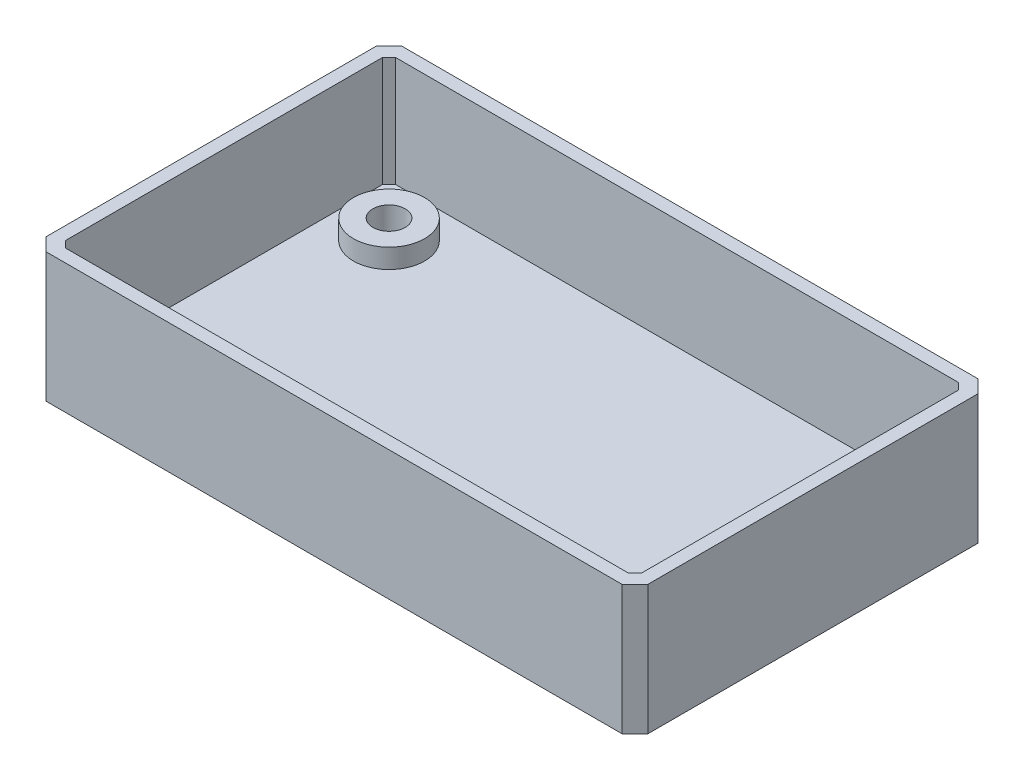
ISO-10303-21;
HEADER;
FILE_DESCRIPTION(('STEP AP214'),'2;1');
FILE_NAME('part.step','',(''),(''),'','','');
FILE_SCHEMA(('AUTOMOTIVE_DESIGN { 1 0 10303 214 1 1 1 1 }'));
ENDSEC;
DATA;
#1=APPLICATION_CONTEXT('core data for automotive mechanical design processes');
#2=APPLICATION_PROTOCOL_DEFINITION('international standard','automotive_design',2000,#1);
#3=PRODUCT_CONTEXT('',#1,'mechanical');
#4=PRODUCT('Part','Part','',(#3));
#5=PRODUCT_RELATED_PRODUCT_CATEGORY('part','',(#4));
#6=PRODUCT_DEFINITION_FORMATION('','',#4);
#7=PRODUCT_DEFINITION_CONTEXT('part definition',#1,'design');
#8=PRODUCT_DEFINITION('design','',#6,#7);
#9=PRODUCT_DEFINITION_SHAPE('','',#8);
#10=(LENGTH_UNIT() NAMED_UNIT(*) SI_UNIT(.MILLI.,.METRE.));
#11=(NAMED_UNIT(*) PLANE_ANGLE_UNIT() SI_UNIT($,.RADIAN.));
#12=(NAMED_UNIT(*) SI_UNIT($,.STERADIAN.) SOLID_ANGLE_UNIT());
#13=UNCERTAINTY_MEASURE_WITH_UNIT(LENGTH_MEASURE(1.E-05),#10,'distance_accuracy_value','');
#14=(GEOMETRIC_REPRESENTATION_CONTEXT(3) GLOBAL_UNCERTAINTY_ASSIGNED_CONTEXT((#13)) GLOBAL_UNIT_ASSIGNED_CONTEXT((#10,
#11,#12)) REPRESENTATION_CONTEXT('',''));
#15=CARTESIAN_POINT('',(0.,0.,0.));
#16=DIRECTION('',(0.,0.,1.));
#17=DIRECTION('',(1.,0.,0.));
#18=AXIS2_PLACEMENT_3D('',#15,#16,#17);
#19=CARTESIAN_POINT('',(0.,3.,0.));
#20=DIRECTION('',(0.,1.,0.));
#21=DIRECTION('',(0.,0.,1.));
#22=AXIS2_PLACEMENT_3D('',#19,#20,#21);
#23=PLANE('',#22);
#24=CARTESIAN_POINT('',(73.,3.,35.));
#25=DIRECTION('',(0.,1.,0.));
#26=DIRECTION('',(0.,0.,1.));
#27=AXIS2_PLACEMENT_3D('',#24,#25,#26);
#28=CIRCLE('',#27,5.5);
#29=CARTESIAN_POINT('',(73.,3.,40.5));
#30=VERTEX_POINT('',#29);
#31=EDGE_CURVE('E326',#30,#30,#28,.T.);
#32=ORIENTED_EDGE('',*,*,#31,.F.);
#33=EDGE_LOOP('',(#32));
#34=FACE_BOUND('',#33,.T.);
#35=CARTESIAN_POINT('',(0.,3.,0.));
#36=DIRECTION('',(0.,1.,0.));
#37=DIRECTION('',(0.,0.,1.));
#38=AXIS2_PLACEMENT_3D('',#35,#36,#37);
#39=CIRCLE('',#38,5.5);
#40=CARTESIAN_POINT('',(0.,3.,5.5));
#41=VERTEX_POINT('',#40);
#42=EDGE_CURVE('E344',#41,#41,#39,.T.);
#43=ORIENTED_EDGE('',*,*,#42,.F.);
#44=EDGE_LOOP('',(#43));
#45=FACE_BOUND('',#44,.T.);
#46=DIRECTION('',(0.,0.,1.));
#47=VECTOR('',#46,1.);
#48=CARTESIAN_POINT('',(-8.,3.,-8.));
#49=LINE('',#48,#47);
#50=CARTESIAN_POINT('',(-8.,3.,-7.));
#51=VERTEX_POINT('',#50);
#52=CARTESIAN_POINT('',(-7.99999999999999,3.,42.));
#53=VERTEX_POINT('',#52);
#54=EDGE_CURVE('E266',#51,#53,#49,.T.);
#55=ORIENTED_EDGE('',*,*,#54,.T.);
#56=DIRECTION('',(-0.707106781186538,0.,-0.707106781186557));
#57=VECTOR('',#56,1.);
#58=CARTESIAN_POINT('',(-25.0000000000001,3.,24.9999999999994));
#59=LINE('',#58,#57);
#60=CARTESIAN_POINT('',(-7.00000000000001,3.,43.));
#61=VERTEX_POINT('',#60);
#62=EDGE_CURVE('E225',#53,#61,#59,.F.);
#63=ORIENTED_EDGE('',*,*,#62,.T.);
#64=DIRECTION('',(1.,0.,0.));
#65=VECTOR('',#64,1.);
#66=CARTESIAN_POINT('',(-7.99999999999999,3.,43.));
#67=LINE('',#66,#65);
#68=CARTESIAN_POINT('',(80.,3.,43.));
#69=VERTEX_POINT('',#68);
#70=EDGE_CURVE('E270',#61,#69,#67,.T.);
#71=ORIENTED_EDGE('',*,*,#70,.T.);
#72=DIRECTION('',(-0.707106781186543,0.,0.707106781186552));
#73=VECTOR('',#72,1.);
#74=CARTESIAN_POINT('',(61.5000000000006,3.,61.4999999999997));
#75=LINE('',#74,#73);
#76=CARTESIAN_POINT('',(81.,3.,42.));
#77=VERTEX_POINT('',#76);
#78=EDGE_CURVE('E219',#69,#77,#75,.F.);
#79=ORIENTED_EDGE('',*,*,#78,.T.);
#80=DIRECTION('',(0.,0.,-1.));
#81=VECTOR('',#80,1.);
#82=CARTESIAN_POINT('',(81.,3.,-8.));
#83=LINE('',#82,#81);
#84=CARTESIAN_POINT('',(81.,3.,-6.99999999999999));
#85=VERTEX_POINT('',#84);
#86=EDGE_CURVE('E184',#77,#85,#83,.T.);
#87=ORIENTED_EDGE('',*,*,#86,.T.);
#88=DIRECTION('',(0.707106781186543,0.,0.707106781186552));
#89=VECTOR('',#88,1.);
#90=CARTESIAN_POINT('',(44.0000000000006,3.,-43.9999999999999));
#91=LINE('',#90,#89);
#92=CARTESIAN_POINT('',(80.,3.,-8.));
#93=VERTEX_POINT('',#92);
#94=EDGE_CURVE('E221',#85,#93,#91,.F.);
#95=ORIENTED_EDGE('',*,*,#94,.T.);
#96=DIRECTION('',(-1.,0.,0.));
#97=VECTOR('',#96,1.);
#98=CARTESIAN_POINT('',(-8.,3.,-8.));
#99=LINE('',#98,#97);
#100=CARTESIAN_POINT('',(-6.99999999999999,3.,-8.));
#101=VERTEX_POINT('',#100);
#102=EDGE_CURVE('E180',#93,#101,#99,.T.);
#103=ORIENTED_EDGE('',*,*,#102,.T.);
#104=DIRECTION('',(0.707106781186552,0.,-0.707106781186543));
#105=VECTOR('',#104,1.);
#106=CARTESIAN_POINT('',(-7.49999999999994,3.,-7.50000000000005));
#107=LINE('',#106,#105);
#108=EDGE_CURVE('E223',#101,#51,#107,.F.);
#109=ORIENTED_EDGE('',*,*,#108,.T.);
#110=EDGE_LOOP('',(#55,#63,#71,#79,#87,#95,#103,#109));
#111=FACE_BOUND('',#110,.T.);
#112=CARTESIAN_POINT('',(73.,3.,0.));
#113=DIRECTION('',(0.,1.,0.));
#114=DIRECTION('',(0.,0.,1.));
#115=AXIS2_PLACEMENT_3D('',#112,#113,#114);
#116=CIRCLE('',#115,5.5);
#117=CARTESIAN_POINT('',(73.,3.,5.5));
#118=VERTEX_POINT('',#117);
#119=EDGE_CURVE('E315',#118,#118,#116,.T.);
#120=ORIENTED_EDGE('',*,*,#119,.F.);
#121=EDGE_LOOP('',(#120));
#122=FACE_BOUND('',#121,.T.);
#123=CARTESIAN_POINT('',(0.,3.,35.));
#124=DIRECTION('',(0.,1.,0.));
#125=DIRECTION('',(0.,0.,1.));
#126=AXIS2_PLACEMENT_3D('',#123,#124,#125);
#127=CIRCLE('',#126,5.5);
#128=CARTESIAN_POINT('',(0.,3.,40.5));
#129=VERTEX_POINT('',#128);
#130=EDGE_CURVE('E335',#129,#129,#127,.T.);
#131=ORIENTED_EDGE('',*,*,#130,.F.);
#132=EDGE_LOOP('',(#131));
#133=FACE_BOUND('',#132,.T.);
#134=ADVANCED_FACE('F41',(#34,#45,#111,#122,#133),#23,.T.);
#135=CARTESIAN_POINT('',(0.,0.,0.));
#136=DIRECTION('',(0.,1.,0.));
#137=DIRECTION('',(0.,0.,1.));
#138=AXIS2_PLACEMENT_3D('',#135,#136,#137);
#139=PLANE('',#138);
#140=CARTESIAN_POINT('',(0.,0.,0.));
#141=DIRECTION('',(0.,1.,0.));
#142=DIRECTION('',(0.,0.,1.));
#143=AXIS2_PLACEMENT_3D('',#140,#141,#142);
#144=CIRCLE('',#143,2.5);
#145=CARTESIAN_POINT('',(0.,0.,2.5));
#146=VERTEX_POINT('',#145);
#147=EDGE_CURVE('E271',#146,#146,#144,.T.);
#148=ORIENTED_EDGE('',*,*,#147,.T.);
#149=EDGE_LOOP('',(#148));
#150=FACE_BOUND('',#149,.T.);
#151=CARTESIAN_POINT('',(73.,0.,0.));
#152=DIRECTION('',(0.,1.,0.));
#153=DIRECTION('',(0.,0.,1.));
#154=AXIS2_PLACEMENT_3D('',#151,#152,#153);
#155=CIRCLE('',#154,2.50000000000001);
#156=CARTESIAN_POINT('',(73.,0.,2.50000000000001));
#157=VERTEX_POINT('',#156);
#158=EDGE_CURVE('E276',#157,#157,#155,.T.);
#159=ORIENTED_EDGE('',*,*,#158,.T.);
#160=EDGE_LOOP('',(#159));
#161=FACE_BOUND('',#160,.T.);
#162=CARTESIAN_POINT('',(0.,0.,35.));
#163=DIRECTION('',(0.,1.,0.));
#164=DIRECTION('',(0.,0.,1.));
#165=AXIS2_PLACEMENT_3D('',#162,#163,#164);
#166=CIRCLE('',#165,2.5);
#167=CARTESIAN_POINT('',(0.,0.,37.5));
#168=VERTEX_POINT('',#167);
#169=EDGE_CURVE('E353',#168,#168,#166,.T.);
#170=ORIENTED_EDGE('',*,*,#169,.T.);
#171=EDGE_LOOP('',(#170));
#172=FACE_BOUND('',#171,.T.);
#173=CARTESIAN_POINT('',(73.,0.,35.));
#174=DIRECTION('',(0.,1.,0.));
#175=DIRECTION('',(0.,0.,1.));
#176=AXIS2_PLACEMENT_3D('',#173,#174,#175);
#177=CIRCLE('',#176,2.50000000000001);
#178=CARTESIAN_POINT('',(73.,0.,37.5));
#179=VERTEX_POINT('',#178);
#180=EDGE_CURVE('E348',#179,#179,#177,.T.);
#181=ORIENTED_EDGE('',*,*,#180,.T.);
#182=EDGE_LOOP('',(#181));
#183=FACE_BOUND('',#182,.T.);
#184=DIRECTION('',(0.,0.,-1.));
#185=VECTOR('',#184,1.);
#186=CARTESIAN_POINT('',(-9.99999999999999,0.,45.));
#187=LINE('',#186,#185);
#188=CARTESIAN_POINT('',(-9.99999999999999,0.,43.));
#189=VERTEX_POINT('',#188);
#190=CARTESIAN_POINT('',(-10.,0.,-8.00000000000003));
#191=VERTEX_POINT('',#190);
#192=EDGE_CURVE('E158',#189,#191,#187,.T.);
#193=ORIENTED_EDGE('',*,*,#192,.T.);
#194=DIRECTION('',(-0.707106781186548,0.,0.707106781186547));
#195=VECTOR('',#194,1.);
#196=CARTESIAN_POINT('',(-10.,0.,-8.00000000000003));
#197=LINE('',#196,#195);
#198=CARTESIAN_POINT('',(-8.00000000000003,0.,-10.));
#199=VERTEX_POINT('',#198);
#200=EDGE_CURVE('E191',#191,#199,#197,.F.);
#201=ORIENTED_EDGE('',*,*,#200,.T.);
#202=DIRECTION('',(1.,0.,0.));
#203=VECTOR('',#202,1.);
#204=CARTESIAN_POINT('',(-10.,0.,-10.));
#205=LINE('',#204,#203);
#206=CARTESIAN_POINT('',(81.,0.,-10.));
#207=VERTEX_POINT('',#206);
#208=EDGE_CURVE('E175',#199,#207,#205,.T.);
#209=ORIENTED_EDGE('',*,*,#208,.T.);
#210=DIRECTION('',(-0.707106781186545,0.,-0.70710678118655));
#211=VECTOR('',#210,1.);
#212=CARTESIAN_POINT('',(81.,0.,-10.));
#213=LINE('',#212,#211);
#214=CARTESIAN_POINT('',(83.,0.,-8.00000000000001));
#215=VERTEX_POINT('',#214);
#216=EDGE_CURVE('E189',#207,#215,#213,.F.);
#217=ORIENTED_EDGE('',*,*,#216,.T.);
#218=DIRECTION('',(0.,0.,1.));
#219=VECTOR('',#218,1.);
#220=CARTESIAN_POINT('',(83.,0.,-10.));
#221=LINE('',#220,#219);
#222=CARTESIAN_POINT('',(83.,0.,43.));
#223=VERTEX_POINT('',#222);
#224=EDGE_CURVE('E301',#215,#223,#221,.T.);
#225=ORIENTED_EDGE('',*,*,#224,.T.);
#226=DIRECTION('',(0.707106781186548,0.,-0.707106781186548));
#227=VECTOR('',#226,1.);
#228=CARTESIAN_POINT('',(83.,0.,43.));
#229=LINE('',#228,#227);
#230=CARTESIAN_POINT('',(81.,0.,45.));
#231=VERTEX_POINT('',#230);
#232=EDGE_CURVE('E165',#223,#231,#229,.F.);
#233=ORIENTED_EDGE('',*,*,#232,.T.);
#234=DIRECTION('',(-1.,0.,0.));
#235=VECTOR('',#234,1.);
#236=CARTESIAN_POINT('',(83.,0.,45.));
#237=LINE('',#236,#235);
#238=CARTESIAN_POINT('',(-7.99999999999999,0.,45.));
#239=VERTEX_POINT('',#238);
#240=EDGE_CURVE('E160',#231,#239,#237,.T.);
#241=ORIENTED_EDGE('',*,*,#240,.T.);
#242=DIRECTION('',(0.707106781186545,0.,0.70710678118655));
#243=VECTOR('',#242,1.);
#244=CARTESIAN_POINT('',(-7.99999999999999,0.,45.));
#245=LINE('',#244,#243);
#246=EDGE_CURVE('E155',#239,#189,#245,.F.);
#247=ORIENTED_EDGE('',*,*,#246,.T.);
#248=EDGE_LOOP('',(#193,#201,#209,#217,#225,#233,#241,#247));
#249=FACE_BOUND('',#248,.T.);
#250=ADVANCED_FACE('F157',(#150,#161,#172,#183,#249),#139,.F.);
#251=CARTESIAN_POINT('',(0.,3.,0.));
#252=DIRECTION('',(0.,-1.,0.));
#253=DIRECTION('',(0.,0.,-1.));
#254=AXIS2_PLACEMENT_3D('',#251,#252,#253);
#255=CYLINDRICAL_SURFACE('',#254,2.5);
#256=ORIENTED_EDGE('',*,*,#147,.F.);
#257=EDGE_LOOP('',(#256));
#258=FACE_BOUND('',#257,.T.);
#259=CARTESIAN_POINT('',(0.,6.,0.));
#260=DIRECTION('',(0.,1.,0.));
#261=DIRECTION('',(0.,0.,1.));
#262=AXIS2_PLACEMENT_3D('',#259,#260,#261);
#263=CIRCLE('',#262,2.5);
#264=CARTESIAN_POINT('',(0.,6.,2.5));
#265=VERTEX_POINT('',#264);
#266=EDGE_CURVE('E325',#265,#265,#263,.T.);
#267=ORIENTED_EDGE('',*,*,#266,.T.);
#268=EDGE_LOOP('',(#267));
#269=FACE_BOUND('',#268,.T.);
#270=ADVANCED_FACE('F364',(#258,#269),#255,.F.);
#271=CARTESIAN_POINT('',(73.,3.,0.));
#272=DIRECTION('',(0.,-1.,0.));
#273=DIRECTION('',(0.,0.,-1.));
#274=AXIS2_PLACEMENT_3D('',#271,#272,#273);
#275=CYLINDRICAL_SURFACE('',#274,2.50000000000001);
#276=ORIENTED_EDGE('',*,*,#158,.F.);
#277=EDGE_LOOP('',(#276));
#278=FACE_BOUND('',#277,.T.);
#279=CARTESIAN_POINT('',(73.,6.,0.));
#280=DIRECTION('',(0.,1.,0.));
#281=DIRECTION('',(0.,0.,1.));
#282=AXIS2_PLACEMENT_3D('',#279,#280,#281);
#283=CIRCLE('',#282,2.50000000000001);
#284=CARTESIAN_POINT('',(73.,6.,2.50000000000001));
#285=VERTEX_POINT('',#284);
#286=EDGE_CURVE('E318',#285,#285,#283,.T.);
#287=ORIENTED_EDGE('',*,*,#286,.T.);
#288=EDGE_LOOP('',(#287));
#289=FACE_BOUND('',#288,.T.);
#290=ADVANCED_FACE('F360',(#278,#289),#275,.F.);
#291=CARTESIAN_POINT('',(0.,3.,35.));
#292=DIRECTION('',(0.,-1.,0.));
#293=DIRECTION('',(0.,0.,-1.));
#294=AXIS2_PLACEMENT_3D('',#291,#292,#293);
#295=CYLINDRICAL_SURFACE('',#294,2.5);
#296=ORIENTED_EDGE('',*,*,#169,.F.);
#297=EDGE_LOOP('',(#296));
#298=FACE_BOUND('',#297,.T.);
#299=CARTESIAN_POINT('',(0.,6.,35.));
#300=DIRECTION('',(0.,1.,0.));
#301=DIRECTION('',(0.,0.,1.));
#302=AXIS2_PLACEMENT_3D('',#299,#300,#301);
#303=CIRCLE('',#302,2.5);
#304=CARTESIAN_POINT('',(0.,6.,37.5));
#305=VERTEX_POINT('',#304);
#306=EDGE_CURVE('E332',#305,#305,#303,.T.);
#307=ORIENTED_EDGE('',*,*,#306,.T.);
#308=EDGE_LOOP('',(#307));
#309=FACE_BOUND('',#308,.T.);
#310=ADVANCED_FACE('F363',(#298,#309),#295,.F.);
#311=CARTESIAN_POINT('',(73.,3.,35.));
#312=DIRECTION('',(0.,-1.,0.));
#313=DIRECTION('',(0.,0.,-1.));
#314=AXIS2_PLACEMENT_3D('',#311,#312,#313);
#315=CYLINDRICAL_SURFACE('',#314,2.50000000000001);
#316=ORIENTED_EDGE('',*,*,#180,.F.);
#317=EDGE_LOOP('',(#316));
#318=FACE_BOUND('',#317,.T.);
#319=CARTESIAN_POINT('',(73.,6.,35.));
#320=DIRECTION('',(0.,1.,0.));
#321=DIRECTION('',(0.,0.,1.));
#322=AXIS2_PLACEMENT_3D('',#319,#320,#321);
#323=CIRCLE('',#322,2.50000000000001);
#324=CARTESIAN_POINT('',(73.,6.,37.5));
#325=VERTEX_POINT('',#324);
#326=EDGE_CURVE('E322',#325,#325,#323,.T.);
#327=ORIENTED_EDGE('',*,*,#326,.T.);
#328=EDGE_LOOP('',(#327));
#329=FACE_BOUND('',#328,.T.);
#330=ADVANCED_FACE('F636',(#318,#329),#315,.F.);
#331=CARTESIAN_POINT('',(73.,6.,35.));
#332=DIRECTION('',(0.,1.,0.));
#333=DIRECTION('',(0.,0.,1.));
#334=AXIS2_PLACEMENT_3D('',#331,#332,#333);
#335=PLANE('',#334);
#336=CARTESIAN_POINT('',(73.,6.,35.));
#337=DIRECTION('',(0.,1.,0.));
#338=DIRECTION('',(0.,0.,1.));
#339=AXIS2_PLACEMENT_3D('',#336,#337,#338);
#340=CIRCLE('',#339,5.5);
#341=CARTESIAN_POINT('',(73.,6.,40.5));
#342=VERTEX_POINT('',#341);
#343=EDGE_CURVE('E329',#342,#342,#340,.T.);
#344=ORIENTED_EDGE('',*,*,#343,.T.);
#345=EDGE_LOOP('',(#344));
#346=FACE_BOUND('',#345,.T.);
#347=ORIENTED_EDGE('',*,*,#326,.F.);
#348=EDGE_LOOP('',(#347));
#349=FACE_BOUND('',#348,.T.);
#350=ADVANCED_FACE('F627',(#346,#349),#335,.T.);
#351=CARTESIAN_POINT('',(73.,6.,35.));
#352=DIRECTION('',(0.,-1.,0.));
#353=DIRECTION('',(0.,0.,-1.));
#354=AXIS2_PLACEMENT_3D('',#351,#352,#353);
#355=CYLINDRICAL_SURFACE('',#354,5.5);
#356=ORIENTED_EDGE('',*,*,#343,.F.);
#357=EDGE_LOOP('',(#356));
#358=FACE_BOUND('',#357,.T.);
#359=ORIENTED_EDGE('',*,*,#31,.T.);
#360=EDGE_LOOP('',(#359));
#361=FACE_BOUND('',#360,.T.);
#362=ADVANCED_FACE('F617',(#358,#361),#355,.T.);
#363=CARTESIAN_POINT('',(0.,6.,35.));
#364=DIRECTION('',(0.,1.,0.));
#365=DIRECTION('',(0.,0.,1.));
#366=AXIS2_PLACEMENT_3D('',#363,#364,#365);
#367=PLANE('',#366);
#368=CARTESIAN_POINT('',(0.,6.,35.));
#369=DIRECTION('',(0.,1.,0.));
#370=DIRECTION('',(0.,0.,1.));
#371=AXIS2_PLACEMENT_3D('',#368,#369,#370);
#372=CIRCLE('',#371,5.5);
#373=CARTESIAN_POINT('',(0.,6.,40.5));
#374=VERTEX_POINT('',#373);
#375=EDGE_CURVE('E309',#374,#374,#372,.T.);
#376=ORIENTED_EDGE('',*,*,#375,.T.);
#377=EDGE_LOOP('',(#376));
#378=FACE_BOUND('',#377,.T.);
#379=ORIENTED_EDGE('',*,*,#306,.F.);
#380=EDGE_LOOP('',(#379));
#381=FACE_BOUND('',#380,.T.);
#382=ADVANCED_FACE('F381',(#378,#381),#367,.T.);
#383=CARTESIAN_POINT('',(0.,6.,35.));
#384=DIRECTION('',(0.,-1.,0.));
#385=DIRECTION('',(0.,0.,-1.));
#386=AXIS2_PLACEMENT_3D('',#383,#384,#385);
#387=CYLINDRICAL_SURFACE('',#386,5.5);
#388=ORIENTED_EDGE('',*,*,#375,.F.);
#389=EDGE_LOOP('',(#388));
#390=FACE_BOUND('',#389,.T.);
#391=ORIENTED_EDGE('',*,*,#130,.T.);
#392=EDGE_LOOP('',(#391));
#393=FACE_BOUND('',#392,.T.);
#394=ADVANCED_FACE('F371',(#390,#393),#387,.T.);
#395=CARTESIAN_POINT('',(73.,6.,0.));
#396=DIRECTION('',(0.,1.,0.));
#397=DIRECTION('',(0.,0.,1.));
#398=AXIS2_PLACEMENT_3D('',#395,#396,#397);
#399=PLANE('',#398);
#400=CARTESIAN_POINT('',(73.,6.,0.));
#401=DIRECTION('',(0.,1.,0.));
#402=DIRECTION('',(0.,0.,1.));
#403=AXIS2_PLACEMENT_3D('',#400,#401,#402);
#404=CIRCLE('',#403,5.5);
#405=CARTESIAN_POINT('',(73.,6.,5.5));
#406=VERTEX_POINT('',#405);
#407=EDGE_CURVE('E319',#406,#406,#404,.T.);
#408=ORIENTED_EDGE('',*,*,#407,.T.);
#409=EDGE_LOOP('',(#408));
#410=FACE_BOUND('',#409,.T.);
#411=ORIENTED_EDGE('',*,*,#286,.F.);
#412=EDGE_LOOP('',(#411));
#413=FACE_BOUND('',#412,.T.);
#414=ADVANCED_FACE('F368',(#410,#413),#399,.T.);
#415=CARTESIAN_POINT('',(73.,6.,0.));
#416=DIRECTION('',(0.,-1.,0.));
#417=DIRECTION('',(0.,0.,-1.));
#418=AXIS2_PLACEMENT_3D('',#415,#416,#417);
#419=CYLINDRICAL_SURFACE('',#418,5.5);
#420=ORIENTED_EDGE('',*,*,#407,.F.);
#421=EDGE_LOOP('',(#420));
#422=FACE_BOUND('',#421,.T.);
#423=ORIENTED_EDGE('',*,*,#119,.T.);
#424=EDGE_LOOP('',(#423));
#425=FACE_BOUND('',#424,.T.);
#426=ADVANCED_FACE('F370',(#422,#425),#419,.T.);
#427=CARTESIAN_POINT('',(0.,6.,0.));
#428=DIRECTION('',(0.,1.,0.));
#429=DIRECTION('',(0.,0.,1.));
#430=AXIS2_PLACEMENT_3D('',#427,#428,#429);
#431=PLANE('',#430);
#432=CARTESIAN_POINT('',(0.,6.,0.));
#433=DIRECTION('',(0.,1.,0.));
#434=DIRECTION('',(0.,0.,1.));
#435=AXIS2_PLACEMENT_3D('',#432,#433,#434);
#436=CIRCLE('',#435,5.5);
#437=CARTESIAN_POINT('',(0.,6.,5.5));
#438=VERTEX_POINT('',#437);
#439=EDGE_CURVE('E345',#438,#438,#436,.T.);
#440=ORIENTED_EDGE('',*,*,#439,.T.);
#441=EDGE_LOOP('',(#440));
#442=FACE_BOUND('',#441,.T.);
#443=ORIENTED_EDGE('',*,*,#266,.F.);
#444=EDGE_LOOP('',(#443));
#445=FACE_BOUND('',#444,.T.);
#446=ADVANCED_FACE('F378',(#442,#445),#431,.T.);
#447=CARTESIAN_POINT('',(0.,6.,0.));
#448=DIRECTION('',(0.,-1.,0.));
#449=DIRECTION('',(0.,0.,-1.));
#450=AXIS2_PLACEMENT_3D('',#447,#448,#449);
#451=CYLINDRICAL_SURFACE('',#450,5.5);
#452=ORIENTED_EDGE('',*,*,#439,.F.);
#453=EDGE_LOOP('',(#452));
#454=FACE_BOUND('',#453,.T.);
#455=ORIENTED_EDGE('',*,*,#42,.T.);
#456=EDGE_LOOP('',(#455));
#457=FACE_BOUND('',#456,.T.);
#458=ADVANCED_FACE('F564',(#454,#457),#451,.T.);
#459=CARTESIAN_POINT('',(83.,20.,45.));
#460=DIRECTION('',(0.,0.,1.));
#461=DIRECTION('',(1.,0.,0.));
#462=AXIS2_PLACEMENT_3D('',#459,#460,#461);
#463=PLANE('',#462);
#464=ORIENTED_EDGE('',*,*,#240,.F.);
#465=DIRECTION('',(0.,1.,0.));
#466=VECTOR('',#465,1.);
#467=CARTESIAN_POINT('',(81.,20.,45.));
#468=LINE('',#467,#466);
#469=CARTESIAN_POINT('',(81.,20.,45.));
#470=VERTEX_POINT('',#469);
#471=EDGE_CURVE('E212',#231,#470,#468,.T.);
#472=ORIENTED_EDGE('',*,*,#471,.T.);
#473=DIRECTION('',(-1.,0.,0.));
#474=VECTOR('',#473,1.);
#475=CARTESIAN_POINT('',(83.,20.,45.));
#476=LINE('',#475,#474);
#477=CARTESIAN_POINT('',(-7.99999999999999,20.,45.));
#478=VERTEX_POINT('',#477);
#479=EDGE_CURVE('E297',#470,#478,#476,.T.);
#480=ORIENTED_EDGE('',*,*,#479,.T.);
#481=DIRECTION('',(0.,-1.,0.));
#482=VECTOR('',#481,1.);
#483=CARTESIAN_POINT('',(-7.99999999999999,20.,45.));
#484=LINE('',#483,#482);
#485=EDGE_CURVE('E210',#478,#239,#484,.T.);
#486=ORIENTED_EDGE('',*,*,#485,.T.);
#487=EDGE_LOOP('',(#464,#472,#480,#486));
#488=FACE_BOUND('',#487,.T.);
#489=ADVANCED_FACE('F554',(#488),#463,.T.);
#490=CARTESIAN_POINT('',(83.,20.,-10.));
#491=DIRECTION('',(1.,0.,0.));
#492=DIRECTION('',(0.,0.,-1.));
#493=AXIS2_PLACEMENT_3D('',#490,#491,#492);
#494=PLANE('',#493);
#495=ORIENTED_EDGE('',*,*,#224,.F.);
#496=DIRECTION('',(0.,1.,0.));
#497=VECTOR('',#496,1.);
#498=CARTESIAN_POINT('',(83.,20.,-8.00000000000001));
#499=LINE('',#498,#497);
#500=CARTESIAN_POINT('',(83.,20.,-8.00000000000001));
#501=VERTEX_POINT('',#500);
#502=EDGE_CURVE('E208',#215,#501,#499,.T.);
#503=ORIENTED_EDGE('',*,*,#502,.T.);
#504=DIRECTION('',(0.,0.,1.));
#505=VECTOR('',#504,1.);
#506=CARTESIAN_POINT('',(83.,20.,-10.));
#507=LINE('',#506,#505);
#508=CARTESIAN_POINT('',(83.,20.,43.));
#509=VERTEX_POINT('',#508);
#510=EDGE_CURVE('E306',#501,#509,#507,.T.);
#511=ORIENTED_EDGE('',*,*,#510,.T.);
#512=DIRECTION('',(0.,-1.,0.));
#513=VECTOR('',#512,1.);
#514=CARTESIAN_POINT('',(83.,20.,43.));
#515=LINE('',#514,#513);
#516=EDGE_CURVE('E205',#509,#223,#515,.T.);
#517=ORIENTED_EDGE('',*,*,#516,.T.);
#518=EDGE_LOOP('',(#495,#503,#511,#517));
#519=FACE_BOUND('',#518,.T.);
#520=ADVANCED_FACE('F544',(#519),#494,.T.);
#521=CARTESIAN_POINT('',(-10.,20.,-10.));
#522=DIRECTION('',(0.,0.,-1.));
#523=DIRECTION('',(-1.,0.,0.));
#524=AXIS2_PLACEMENT_3D('',#521,#522,#523);
#525=PLANE('',#524);
#526=ORIENTED_EDGE('',*,*,#208,.F.);
#527=DIRECTION('',(0.,1.,0.));
#528=VECTOR('',#527,1.);
#529=CARTESIAN_POINT('',(-8.00000000000003,20.,-10.));
#530=LINE('',#529,#528);
#531=CARTESIAN_POINT('',(-8.00000000000003,20.,-10.));
#532=VERTEX_POINT('',#531);
#533=EDGE_CURVE('E196',#199,#532,#530,.T.);
#534=ORIENTED_EDGE('',*,*,#533,.T.);
#535=DIRECTION('',(1.,0.,0.));
#536=VECTOR('',#535,1.);
#537=CARTESIAN_POINT('',(-10.,20.,-10.));
#538=LINE('',#537,#536);
#539=CARTESIAN_POINT('',(81.,20.,-10.));
#540=VERTEX_POINT('',#539);
#541=EDGE_CURVE('E303',#532,#540,#538,.T.);
#542=ORIENTED_EDGE('',*,*,#541,.T.);
#543=DIRECTION('',(0.,-1.,0.));
#544=VECTOR('',#543,1.);
#545=CARTESIAN_POINT('',(81.,20.,-10.));
#546=LINE('',#545,#544);
#547=EDGE_CURVE('E193',#540,#207,#546,.T.);
#548=ORIENTED_EDGE('',*,*,#547,.T.);
#549=EDGE_LOOP('',(#526,#534,#542,#548));
#550=FACE_BOUND('',#549,.T.);
#551=ADVANCED_FACE('F535',(#550),#525,.T.);
#552=CARTESIAN_POINT('',(-9.99999999999999,20.,45.));
#553=DIRECTION('',(-1.,0.,0.));
#554=DIRECTION('',(0.,0.,1.));
#555=AXIS2_PLACEMENT_3D('',#552,#553,#554);
#556=PLANE('',#555);
#557=DIRECTION('',(0.,0.,-1.));
#558=VECTOR('',#557,1.);
#559=CARTESIAN_POINT('',(-9.99999999999999,20.,45.));
#560=LINE('',#559,#558);
#561=CARTESIAN_POINT('',(-9.99999999999999,20.,43.));
#562=VERTEX_POINT('',#561);
#563=CARTESIAN_POINT('',(-10.,20.,-8.00000000000003));
#564=VERTEX_POINT('',#563);
#565=EDGE_CURVE('E300',#562,#564,#560,.T.);
#566=ORIENTED_EDGE('',*,*,#565,.T.);
#567=DIRECTION('',(0.,-1.,0.));
#568=VECTOR('',#567,1.);
#569=CARTESIAN_POINT('',(-10.,20.,-8.00000000000003));
#570=LINE('',#569,#568);
#571=EDGE_CURVE('E166',#564,#191,#570,.T.);
#572=ORIENTED_EDGE('',*,*,#571,.T.);
#573=ORIENTED_EDGE('',*,*,#192,.F.);
#574=DIRECTION('',(0.,1.,0.));
#575=VECTOR('',#574,1.);
#576=CARTESIAN_POINT('',(-9.99999999999999,20.,43.));
#577=LINE('',#576,#575);
#578=EDGE_CURVE('E172',#189,#562,#577,.T.);
#579=ORIENTED_EDGE('',*,*,#578,.T.);
#580=EDGE_LOOP('',(#566,#572,#573,#579));
#581=FACE_BOUND('',#580,.T.);
#582=ADVANCED_FACE('F171',(#581),#556,.T.);
#583=CARTESIAN_POINT('',(0.,20.,0.));
#584=DIRECTION('',(0.,-1.,0.));
#585=DIRECTION('',(0.,0.,-1.));
#586=AXIS2_PLACEMENT_3D('',#583,#584,#585);
#587=PLANE('',#586);
#588=DIRECTION('',(1.,0.,0.));
#589=VECTOR('',#588,1.);
#590=CARTESIAN_POINT('',(-8.,20.,-8.));
#591=LINE('',#590,#589);
#592=CARTESIAN_POINT('',(-6.99999999999999,20.,-8.));
#593=VERTEX_POINT('',#592);
#594=CARTESIAN_POINT('',(80.,20.,-8.));
#595=VERTEX_POINT('',#594);
#596=EDGE_CURVE('E249',#593,#595,#591,.T.);
#597=ORIENTED_EDGE('',*,*,#596,.T.);
#598=DIRECTION('',(-0.707106781186543,0.,-0.707106781186552));
#599=VECTOR('',#598,1.);
#600=CARTESIAN_POINT('',(44.0000000000006,20.,-43.9999999999999));
#601=LINE('',#600,#599);
#602=CARTESIAN_POINT('',(81.,20.,-6.99999999999999));
#603=VERTEX_POINT('',#602);
#604=EDGE_CURVE('E50',#595,#603,#601,.F.);
#605=ORIENTED_EDGE('',*,*,#604,.T.);
#606=DIRECTION('',(0.,0.,1.));
#607=VECTOR('',#606,1.);
#608=CARTESIAN_POINT('',(81.,20.,-8.));
#609=LINE('',#608,#607);
#610=CARTESIAN_POINT('',(81.,20.,42.));
#611=VERTEX_POINT('',#610);
#612=EDGE_CURVE('E259',#603,#611,#609,.T.);
#613=ORIENTED_EDGE('',*,*,#612,.T.);
#614=DIRECTION('',(0.707106781186543,0.,-0.707106781186552));
#615=VECTOR('',#614,1.);
#616=CARTESIAN_POINT('',(61.5000000000006,20.,61.4999999999997));
#617=LINE('',#616,#615);
#618=CARTESIAN_POINT('',(80.,20.,43.));
#619=VERTEX_POINT('',#618);
#620=EDGE_CURVE('E11',#611,#619,#617,.F.);
#621=ORIENTED_EDGE('',*,*,#620,.T.);
#622=DIRECTION('',(-1.,0.,0.));
#623=VECTOR('',#622,1.);
#624=CARTESIAN_POINT('',(81.,20.,43.));
#625=LINE('',#624,#623);
#626=CARTESIAN_POINT('',(-7.00000000000001,20.,43.));
#627=VERTEX_POINT('',#626);
#628=EDGE_CURVE('E287',#619,#627,#625,.T.);
#629=ORIENTED_EDGE('',*,*,#628,.T.);
#630=DIRECTION('',(0.707106781186538,0.,0.707106781186557));
#631=VECTOR('',#630,1.);
#632=CARTESIAN_POINT('',(-25.0000000000001,20.,24.9999999999994));
#633=LINE('',#632,#631);
#634=CARTESIAN_POINT('',(-7.99999999999999,20.,42.));
#635=VERTEX_POINT('',#634);
#636=EDGE_CURVE('E241',#627,#635,#633,.F.);
#637=ORIENTED_EDGE('',*,*,#636,.T.);
#638=DIRECTION('',(0.,0.,-1.));
#639=VECTOR('',#638,1.);
#640=CARTESIAN_POINT('',(-7.99999999999999,20.,43.));
#641=LINE('',#640,#639);
#642=CARTESIAN_POINT('',(-8.,20.,-7.));
#643=VERTEX_POINT('',#642);
#644=EDGE_CURVE('E251',#635,#643,#641,.T.);
#645=ORIENTED_EDGE('',*,*,#644,.T.);
#646=DIRECTION('',(-0.707106781186552,0.,0.707106781186543));
#647=VECTOR('',#646,1.);
#648=CARTESIAN_POINT('',(-7.49999999999994,20.,-7.50000000000005));
#649=LINE('',#648,#647);
#650=EDGE_CURVE('E243',#643,#593,#649,.F.);
#651=ORIENTED_EDGE('',*,*,#650,.T.);
#652=EDGE_LOOP('',(#597,#605,#613,#621,#629,#637,#645,#651));
#653=FACE_BOUND('',#652,.T.);
#654=ORIENTED_EDGE('',*,*,#541,.F.);
#655=DIRECTION('',(0.707106781186548,0.,-0.707106781186547));
#656=VECTOR('',#655,1.);
#657=CARTESIAN_POINT('',(-10.,20.,-8.00000000000003));
#658=LINE('',#657,#656);
#659=EDGE_CURVE('E203',#532,#564,#658,.F.);
#660=ORIENTED_EDGE('',*,*,#659,.T.);
#661=ORIENTED_EDGE('',*,*,#565,.F.);
#662=DIRECTION('',(-0.707106781186545,0.,-0.70710678118655));
#663=VECTOR('',#662,1.);
#664=CARTESIAN_POINT('',(-7.99999999999999,20.,45.));
#665=LINE('',#664,#663);
#666=EDGE_CURVE('E179',#562,#478,#665,.F.);
#667=ORIENTED_EDGE('',*,*,#666,.T.);
#668=ORIENTED_EDGE('',*,*,#479,.F.);
#669=DIRECTION('',(-0.707106781186548,0.,0.707106781186548));
#670=VECTOR('',#669,1.);
#671=CARTESIAN_POINT('',(83.,20.,43.));
#672=LINE('',#671,#670);
#673=EDGE_CURVE('E199',#470,#509,#672,.F.);
#674=ORIENTED_EDGE('',*,*,#673,.T.);
#675=ORIENTED_EDGE('',*,*,#510,.F.);
#676=DIRECTION('',(0.707106781186545,0.,0.70710678118655));
#677=VECTOR('',#676,1.);
#678=CARTESIAN_POINT('',(81.,20.,-10.));
#679=LINE('',#678,#677);
#680=EDGE_CURVE('E201',#501,#540,#679,.F.);
#681=ORIENTED_EDGE('',*,*,#680,.T.);
#682=EDGE_LOOP('',(#654,#660,#661,#667,#668,#674,#675,#681));
#683=FACE_BOUND('',#682,.T.);
#684=ADVANCED_FACE('F247',(#653,#683),#587,.F.);
#685=CARTESIAN_POINT('',(81.,20.,43.));
#686=DIRECTION('',(0.,0.,1.));
#687=DIRECTION('',(1.,0.,0.));
#688=AXIS2_PLACEMENT_3D('',#685,#686,#687);
#689=PLANE('',#688);
#690=ORIENTED_EDGE('',*,*,#70,.F.);
#691=DIRECTION('',(0.,1.,0.));
#692=VECTOR('',#691,1.);
#693=CARTESIAN_POINT('',(-7.00000000000001,20.,43.));
#694=LINE('',#693,#692);
#695=EDGE_CURVE('E230',#61,#627,#694,.T.);
#696=ORIENTED_EDGE('',*,*,#695,.T.);
#697=ORIENTED_EDGE('',*,*,#628,.F.);
#698=DIRECTION('',(0.,-1.,0.));
#699=VECTOR('',#698,1.);
#700=CARTESIAN_POINT('',(80.,3.,43.));
#701=LINE('',#700,#699);
#702=EDGE_CURVE('E227',#619,#69,#701,.T.);
#703=ORIENTED_EDGE('',*,*,#702,.T.);
#704=EDGE_LOOP('',(#690,#696,#697,#703));
#705=FACE_BOUND('',#704,.T.);
#706=ADVANCED_FACE('F291',(#705),#689,.F.);
#707=CARTESIAN_POINT('',(81.,20.,-8.));
#708=DIRECTION('',(1.,0.,0.));
#709=DIRECTION('',(0.,0.,-1.));
#710=AXIS2_PLACEMENT_3D('',#707,#708,#709);
#711=PLANE('',#710);
#712=ORIENTED_EDGE('',*,*,#612,.F.);
#713=DIRECTION('',(0.,-1.,0.));
#714=VECTOR('',#713,1.);
#715=CARTESIAN_POINT('',(81.,3.,-6.99999999999999));
#716=LINE('',#715,#714);
#717=EDGE_CURVE('E238',#603,#85,#716,.T.);
#718=ORIENTED_EDGE('',*,*,#717,.T.);
#719=ORIENTED_EDGE('',*,*,#86,.F.);
#720=DIRECTION('',(0.,1.,0.));
#721=VECTOR('',#720,1.);
#722=CARTESIAN_POINT('',(81.,20.,42.));
#723=LINE('',#722,#721);
#724=EDGE_CURVE('E57',#77,#611,#723,.T.);
#725=ORIENTED_EDGE('',*,*,#724,.T.);
#726=EDGE_LOOP('',(#712,#718,#719,#725));
#727=FACE_BOUND('',#726,.T.);
#728=ADVANCED_FACE('F280',(#727),#711,.F.);
#729=CARTESIAN_POINT('',(-8.,20.,-8.));
#730=DIRECTION('',(0.,0.,-1.));
#731=DIRECTION('',(-1.,0.,0.));
#732=AXIS2_PLACEMENT_3D('',#729,#730,#731);
#733=PLANE('',#732);
#734=ORIENTED_EDGE('',*,*,#596,.F.);
#735=DIRECTION('',(0.,-1.,0.));
#736=VECTOR('',#735,1.);
#737=CARTESIAN_POINT('',(-6.99999999999999,3.,-8.));
#738=LINE('',#737,#736);
#739=EDGE_CURVE('E234',#593,#101,#738,.T.);
#740=ORIENTED_EDGE('',*,*,#739,.T.);
#741=ORIENTED_EDGE('',*,*,#102,.F.);
#742=DIRECTION('',(0.,1.,0.));
#743=VECTOR('',#742,1.);
#744=CARTESIAN_POINT('',(80.,20.,-8.));
#745=LINE('',#744,#743);
#746=EDGE_CURVE('E232',#93,#595,#745,.T.);
#747=ORIENTED_EDGE('',*,*,#746,.T.);
#748=EDGE_LOOP('',(#734,#740,#741,#747));
#749=FACE_BOUND('',#748,.T.);
#750=ADVANCED_FACE('F256',(#749),#733,.F.);
#751=CARTESIAN_POINT('',(-7.99999999999999,20.,43.));
#752=DIRECTION('',(-1.,0.,0.));
#753=DIRECTION('',(0.,0.,1.));
#754=AXIS2_PLACEMENT_3D('',#751,#752,#753);
#755=PLANE('',#754);
#756=ORIENTED_EDGE('',*,*,#644,.F.);
#757=DIRECTION('',(0.,-1.,0.));
#758=VECTOR('',#757,1.);
#759=CARTESIAN_POINT('',(-7.99999999999999,3.,42.));
#760=LINE('',#759,#758);
#761=EDGE_CURVE('E216',#635,#53,#760,.T.);
#762=ORIENTED_EDGE('',*,*,#761,.T.);
#763=ORIENTED_EDGE('',*,*,#54,.F.);
#764=DIRECTION('',(0.,1.,0.));
#765=VECTOR('',#764,1.);
#766=CARTESIAN_POINT('',(-8.,20.,-7.));
#767=LINE('',#766,#765);
#768=EDGE_CURVE('E214',#51,#643,#767,.T.);
#769=ORIENTED_EDGE('',*,*,#768,.T.);
#770=EDGE_LOOP('',(#756,#762,#763,#769));
#771=FACE_BOUND('',#770,.T.);
#772=ADVANCED_FACE('F268',(#771),#755,.F.);
#773=CARTESIAN_POINT('',(-10.,20.,-8.00000000000003));
#774=DIRECTION('',(0.707106781186547,0.,0.707106781186548));
#775=DIRECTION('',(0.,-1.,0.));
#776=AXIS2_PLACEMENT_3D('',#773,#774,#775);
#777=PLANE('',#776);
#778=ORIENTED_EDGE('',*,*,#659,.F.);
#779=ORIENTED_EDGE('',*,*,#533,.F.);
#780=ORIENTED_EDGE('',*,*,#200,.F.);
#781=ORIENTED_EDGE('',*,*,#571,.F.);
#782=EDGE_LOOP('',(#778,#779,#780,#781));
#783=FACE_BOUND('',#782,.T.);
#784=ADVANCED_FACE('F400',(#783),#777,.F.);
#785=CARTESIAN_POINT('',(81.,20.,-10.));
#786=DIRECTION('',(-0.70710678118655,0.,0.707106781186545));
#787=DIRECTION('',(0.,-1.,0.));
#788=AXIS2_PLACEMENT_3D('',#785,#786,#787);
#789=PLANE('',#788);
#790=ORIENTED_EDGE('',*,*,#680,.F.);
#791=ORIENTED_EDGE('',*,*,#502,.F.);
#792=ORIENTED_EDGE('',*,*,#216,.F.);
#793=ORIENTED_EDGE('',*,*,#547,.F.);
#794=EDGE_LOOP('',(#790,#791,#792,#793));
#795=FACE_BOUND('',#794,.T.);
#796=ADVANCED_FACE('F406',(#795),#789,.F.);
#797=CARTESIAN_POINT('',(83.,20.,43.));
#798=DIRECTION('',(-0.707106781186547,0.,-0.707106781186547));
#799=DIRECTION('',(0.,-1.,0.));
#800=AXIS2_PLACEMENT_3D('',#797,#798,#799);
#801=PLANE('',#800);
#802=ORIENTED_EDGE('',*,*,#673,.F.);
#803=ORIENTED_EDGE('',*,*,#471,.F.);
#804=ORIENTED_EDGE('',*,*,#232,.F.);
#805=ORIENTED_EDGE('',*,*,#516,.F.);
#806=EDGE_LOOP('',(#802,#803,#804,#805));
#807=FACE_BOUND('',#806,.T.);
#808=ADVANCED_FACE('F413',(#807),#801,.F.);
#809=CARTESIAN_POINT('',(-7.99999999999999,20.,45.));
#810=DIRECTION('',(0.70710678118655,0.,-0.707106781186545));
#811=DIRECTION('',(0.,-1.,0.));
#812=AXIS2_PLACEMENT_3D('',#809,#810,#811);
#813=PLANE('',#812);
#814=ORIENTED_EDGE('',*,*,#666,.F.);
#815=ORIENTED_EDGE('',*,*,#578,.F.);
#816=ORIENTED_EDGE('',*,*,#246,.F.);
#817=ORIENTED_EDGE('',*,*,#485,.F.);
#818=EDGE_LOOP('',(#814,#815,#816,#817));
#819=FACE_BOUND('',#818,.T.);
#820=ADVANCED_FACE('F178',(#819),#813,.F.);
#821=CARTESIAN_POINT('',(-7.99999999999999,20.,42.));
#822=DIRECTION('',(0.707106781186557,0.,-0.707106781186538));
#823=DIRECTION('',(0.,1.,0.));
#824=AXIS2_PLACEMENT_3D('',#821,#822,#823);
#825=PLANE('',#824);
#826=ORIENTED_EDGE('',*,*,#636,.F.);
#827=ORIENTED_EDGE('',*,*,#695,.F.);
#828=ORIENTED_EDGE('',*,*,#62,.F.);
#829=ORIENTED_EDGE('',*,*,#761,.F.);
#830=EDGE_LOOP('',(#826,#827,#828,#829));
#831=FACE_BOUND('',#830,.T.);
#832=ADVANCED_FACE('F425',(#831),#825,.T.);
#833=CARTESIAN_POINT('',(-6.99999999999999,20.,-8.));
#834=DIRECTION('',(0.707106781186542,0.,0.707106781186552));
#835=DIRECTION('',(0.,1.,0.));
#836=AXIS2_PLACEMENT_3D('',#833,#834,#835);
#837=PLANE('',#836);
#838=ORIENTED_EDGE('',*,*,#650,.F.);
#839=ORIENTED_EDGE('',*,*,#768,.F.);
#840=ORIENTED_EDGE('',*,*,#108,.F.);
#841=ORIENTED_EDGE('',*,*,#739,.F.);
#842=EDGE_LOOP('',(#838,#839,#840,#841));
#843=FACE_BOUND('',#842,.T.);
#844=ADVANCED_FACE('F261',(#843),#837,.T.);
#845=CARTESIAN_POINT('',(81.,20.,-6.99999999999999));
#846=DIRECTION('',(-0.707106781186552,0.,0.707106781186542));
#847=DIRECTION('',(0.,1.,0.));
#848=AXIS2_PLACEMENT_3D('',#845,#846,#847);
#849=PLANE('',#848);
#850=ORIENTED_EDGE('',*,*,#604,.F.);
#851=ORIENTED_EDGE('',*,*,#746,.F.);
#852=ORIENTED_EDGE('',*,*,#94,.F.);
#853=ORIENTED_EDGE('',*,*,#717,.F.);
#854=EDGE_LOOP('',(#850,#851,#852,#853));
#855=FACE_BOUND('',#854,.T.);
#856=ADVANCED_FACE('F436',(#855),#849,.T.);
#857=CARTESIAN_POINT('',(80.,20.,43.));
#858=DIRECTION('',(-0.707106781186552,0.,-0.707106781186543));
#859=DIRECTION('',(0.,1.,0.));
#860=AXIS2_PLACEMENT_3D('',#857,#858,#859);
#861=PLANE('',#860);
#862=ORIENTED_EDGE('',*,*,#620,.F.);
#863=ORIENTED_EDGE('',*,*,#724,.F.);
#864=ORIENTED_EDGE('',*,*,#78,.F.);
#865=ORIENTED_EDGE('',*,*,#702,.F.);
#866=EDGE_LOOP('',(#862,#863,#864,#865));
#867=FACE_BOUND('',#866,.T.);
#868=ADVANCED_FACE('F44',(#867),#861,.T.);
#869=CLOSED_SHELL('',(#134,#250,#270,#290,#310,#330,#350,#362,#382,#394,#414,#426,#446,#458,
#489,#520,#551,#582,#684,#706,#728,#750,#772,#784,#796,#808,#820,#832,#844,#856,#868));
#870=MANIFOLD_SOLID_BREP('B2',#869);
#871=ADVANCED_BREP_SHAPE_REPRESENTATION('',(#18,#870),#14);
#872=SHAPE_DEFINITION_REPRESENTATION(#9,#871);
ENDSEC;
END-ISO-10303-21;
